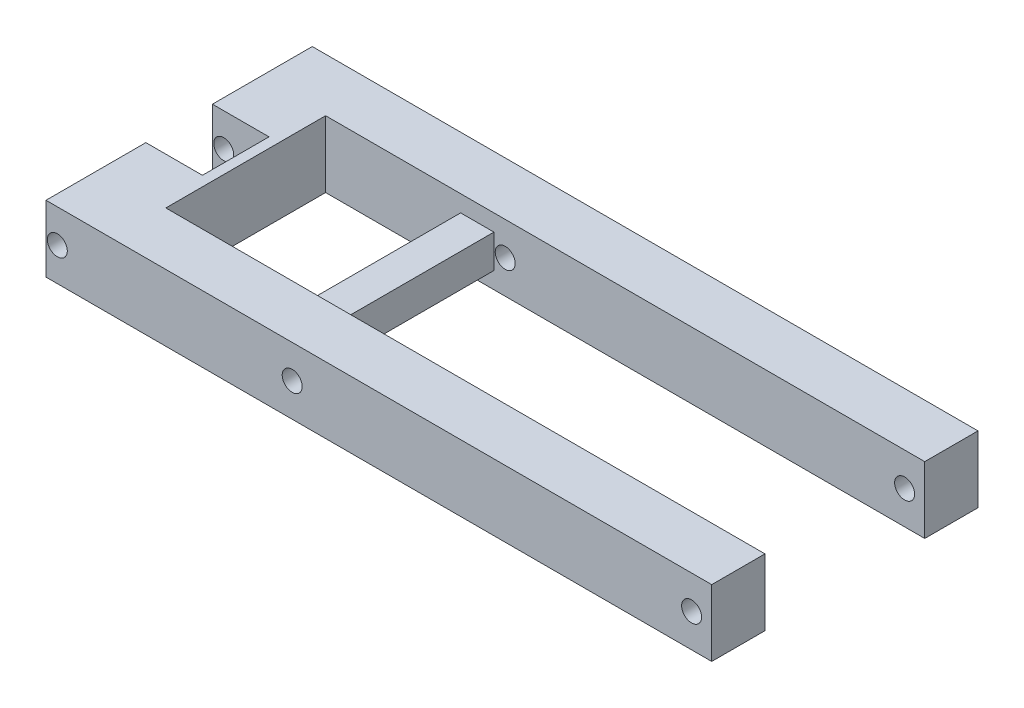
ISO-10303-21;
HEADER;
FILE_DESCRIPTION(('STEP AP214'),'2;1');
FILE_NAME('part.step','',(''),(''),'','','');
FILE_SCHEMA(('AUTOMOTIVE_DESIGN { 1 0 10303 214 1 1 1 1 }'));
ENDSEC;
DATA;
#1=APPLICATION_CONTEXT('core data for automotive mechanical design processes');
#2=APPLICATION_PROTOCOL_DEFINITION('international standard','automotive_design',2000,#1);
#3=PRODUCT_CONTEXT('',#1,'mechanical');
#4=PRODUCT('Part','Part','',(#3));
#5=PRODUCT_RELATED_PRODUCT_CATEGORY('part','',(#4));
#6=PRODUCT_DEFINITION_FORMATION('','',#4);
#7=PRODUCT_DEFINITION_CONTEXT('part definition',#1,'design');
#8=PRODUCT_DEFINITION('design','',#6,#7);
#9=PRODUCT_DEFINITION_SHAPE('','',#8);
#10=(LENGTH_UNIT() NAMED_UNIT(*) SI_UNIT(.MILLI.,.METRE.));
#11=(NAMED_UNIT(*) PLANE_ANGLE_UNIT() SI_UNIT($,.RADIAN.));
#12=(NAMED_UNIT(*) SI_UNIT($,.STERADIAN.) SOLID_ANGLE_UNIT());
#13=UNCERTAINTY_MEASURE_WITH_UNIT(LENGTH_MEASURE(1.E-05),#10,'distance_accuracy_value','');
#14=(GEOMETRIC_REPRESENTATION_CONTEXT(3) GLOBAL_UNCERTAINTY_ASSIGNED_CONTEXT((#13)) GLOBAL_UNIT_ASSIGNED_CONTEXT((#10,
#11,#12)) REPRESENTATION_CONTEXT('',''));
#15=CARTESIAN_POINT('',(0.,0.,0.));
#16=DIRECTION('',(0.,0.,1.));
#17=DIRECTION('',(1.,0.,0.));
#18=AXIS2_PLACEMENT_3D('',#15,#16,#17);
#19=CARTESIAN_POINT('',(-332.846822005894,100.,200.));
#20=DIRECTION('',(1.,0.,0.));
#21=DIRECTION('',(0.,0.,-1.));
#22=AXIS2_PLACEMENT_3D('',#19,#20,#21);
#23=PLANE('',#22);
#24=DIRECTION('',(0.,-1.,0.));
#25=VECTOR('',#24,1.);
#26=CARTESIAN_POINT('',(-332.846822005894,100.,50.));
#27=LINE('',#26,#25);
#28=CARTESIAN_POINT('',(-332.846822005894,100.,50.));
#29=VERTEX_POINT('',#28);
#30=CARTESIAN_POINT('',(-332.846822005894,0.,50.));
#31=VERTEX_POINT('',#30);
#32=EDGE_CURVE('E227',#29,#31,#27,.T.);
#33=ORIENTED_EDGE('',*,*,#32,.T.);
#34=DIRECTION('',(0.,0.,1.));
#35=VECTOR('',#34,1.);
#36=CARTESIAN_POINT('',(-332.846822005894,0.,200.));
#37=LINE('',#36,#35);
#38=CARTESIAN_POINT('',(-332.846822005894,0.,200.));
#39=VERTEX_POINT('',#38);
#40=EDGE_CURVE('E322',#31,#39,#37,.T.);
#41=ORIENTED_EDGE('',*,*,#40,.T.);
#42=DIRECTION('',(0.,-1.,0.));
#43=VECTOR('',#42,1.);
#44=CARTESIAN_POINT('',(-332.846822005894,100.,200.));
#45=LINE('',#44,#43);
#46=CARTESIAN_POINT('',(-332.846822005894,100.,200.));
#47=VERTEX_POINT('',#46);
#48=EDGE_CURVE('E339',#47,#39,#45,.T.);
#49=ORIENTED_EDGE('',*,*,#48,.F.);
#50=DIRECTION('',(0.,0.,1.));
#51=VECTOR('',#50,1.);
#52=CARTESIAN_POINT('',(-332.846822005894,100.,200.));
#53=LINE('',#52,#51);
#54=EDGE_CURVE('E295',#29,#47,#53,.T.);
#55=ORIENTED_EDGE('',*,*,#54,.F.);
#56=EDGE_LOOP('',(#33,#41,#49,#55));
#57=FACE_BOUND('',#56,.T.);
#58=ADVANCED_FACE('F39',(#57),#23,.F.);
#59=CARTESIAN_POINT('',(-315.846822005894,50.,-200.));
#60=DIRECTION('',(0.,0.,1.));
#61=DIRECTION('',(1.,0.,0.));
#62=AXIS2_PLACEMENT_3D('',#59,#60,#61);
#63=CYLINDRICAL_SURFACE('',#62,15.);
#64=CARTESIAN_POINT('',(-315.846822005894,50.,200.));
#65=DIRECTION('',(0.,0.,1.));
#66=DIRECTION('',(1.,0.,0.));
#67=AXIS2_PLACEMENT_3D('',#64,#65,#66);
#68=CIRCLE('',#67,15.);
#69=CARTESIAN_POINT('',(-300.846822005894,50.,200.));
#70=VERTEX_POINT('',#69);
#71=EDGE_CURVE('E237',#70,#70,#68,.T.);
#72=ORIENTED_EDGE('',*,*,#71,.T.);
#73=EDGE_LOOP('',(#72));
#74=FACE_BOUND('',#73,.T.);
#75=CARTESIAN_POINT('',(-315.846822005894,50.,50.));
#76=DIRECTION('',(0.,0.,-1.));
#77=DIRECTION('',(-1.,0.,0.));
#78=AXIS2_PLACEMENT_3D('',#75,#76,#77);
#79=CIRCLE('',#78,15.);
#80=CARTESIAN_POINT('',(-330.846822005894,50.,50.));
#81=VERTEX_POINT('',#80);
#82=EDGE_CURVE('E226',#81,#81,#79,.F.);
#83=ORIENTED_EDGE('',*,*,#82,.F.);
#84=EDGE_LOOP('',(#83));
#85=FACE_BOUND('',#84,.T.);
#86=ADVANCED_FACE('F388',(#74,#85),#63,.F.);
#87=CARTESIAN_POINT('',(667.153177994106,100.,120.));
#88=DIRECTION('',(0.,0.,1.));
#89=DIRECTION('',(1.,0.,0.));
#90=AXIS2_PLACEMENT_3D('',#87,#88,#89);
#91=PLANE('',#90);
#92=DIRECTION('',(-1.,0.,0.));
#93=VECTOR('',#92,1.);
#94=CARTESIAN_POINT('',(-30.,75.,120.));
#95=LINE('',#94,#93);
#96=CARTESIAN_POINT('',(20.,75.,120.));
#97=VERTEX_POINT('',#96);
#98=CARTESIAN_POINT('',(-30.,75.,120.));
#99=VERTEX_POINT('',#98);
#100=EDGE_CURVE('E168',#97,#99,#95,.T.);
#101=ORIENTED_EDGE('',*,*,#100,.T.);
#102=DIRECTION('',(0.,-1.,0.));
#103=VECTOR('',#102,1.);
#104=CARTESIAN_POINT('',(-30.,25.,120.));
#105=LINE('',#104,#103);
#106=CARTESIAN_POINT('',(-30.,25.,120.));
#107=VERTEX_POINT('',#106);
#108=EDGE_CURVE('E57',#99,#107,#105,.T.);
#109=ORIENTED_EDGE('',*,*,#108,.T.);
#110=DIRECTION('',(1.,0.,0.));
#111=VECTOR('',#110,1.);
#112=CARTESIAN_POINT('',(20.,25.,120.));
#113=LINE('',#112,#111);
#114=CARTESIAN_POINT('',(20.,25.,120.));
#115=VERTEX_POINT('',#114);
#116=EDGE_CURVE('E175',#107,#115,#113,.T.);
#117=ORIENTED_EDGE('',*,*,#116,.T.);
#118=DIRECTION('',(0.,1.,0.));
#119=VECTOR('',#118,1.);
#120=CARTESIAN_POINT('',(20.,75.,120.));
#121=LINE('',#120,#119);
#122=EDGE_CURVE('E158',#115,#97,#121,.T.);
#123=ORIENTED_EDGE('',*,*,#122,.T.);
#124=EDGE_LOOP('',(#101,#109,#117,#123));
#125=FACE_BOUND('',#124,.T.);
#126=CARTESIAN_POINT('',(36.953177994106,50.,120.));
#127=DIRECTION('',(0.,0.,1.));
#128=DIRECTION('',(1.,0.,0.));
#129=AXIS2_PLACEMENT_3D('',#126,#127,#128);
#130=CIRCLE('',#129,15.0000000000001);
#131=CARTESIAN_POINT('',(51.9531779941061,50.,120.));
#132=VERTEX_POINT('',#131);
#133=EDGE_CURVE('E273',#132,#132,#130,.T.);
#134=ORIENTED_EDGE('',*,*,#133,.T.);
#135=EDGE_LOOP('',(#134));
#136=FACE_BOUND('',#135,.T.);
#137=CARTESIAN_POINT('',(636.953177994106,50.,120.));
#138=DIRECTION('',(0.,0.,1.));
#139=DIRECTION('',(1.,0.,0.));
#140=AXIS2_PLACEMENT_3D('',#137,#138,#139);
#141=CIRCLE('',#140,15.);
#142=CARTESIAN_POINT('',(651.953177994106,50.,120.));
#143=VERTEX_POINT('',#142);
#144=EDGE_CURVE('E265',#143,#143,#141,.T.);
#145=ORIENTED_EDGE('',*,*,#144,.T.);
#146=EDGE_LOOP('',(#145));
#147=FACE_BOUND('',#146,.T.);
#148=DIRECTION('',(-1.,0.,0.));
#149=VECTOR('',#148,1.);
#150=CARTESIAN_POINT('',(667.153177994106,0.,120.));
#151=LINE('',#150,#149);
#152=CARTESIAN_POINT('',(667.153177994106,0.,120.));
#153=VERTEX_POINT('',#152);
#154=CARTESIAN_POINT('',(-232.846822005894,0.,120.));
#155=VERTEX_POINT('',#154);
#156=EDGE_CURVE('E277',#153,#155,#151,.T.);
#157=ORIENTED_EDGE('',*,*,#156,.T.);
#158=DIRECTION('',(0.,-1.,0.));
#159=VECTOR('',#158,1.);
#160=CARTESIAN_POINT('',(-232.846822005894,100.,120.));
#161=LINE('',#160,#159);
#162=CARTESIAN_POINT('',(-232.846822005894,100.,120.));
#163=VERTEX_POINT('',#162);
#164=EDGE_CURVE('E11',#163,#155,#161,.T.);
#165=ORIENTED_EDGE('',*,*,#164,.F.);
#166=DIRECTION('',(-1.,0.,0.));
#167=VECTOR('',#166,1.);
#168=CARTESIAN_POINT('',(667.153177994106,100.,120.));
#169=LINE('',#168,#167);
#170=CARTESIAN_POINT('',(667.153177994106,100.,120.));
#171=VERTEX_POINT('',#170);
#172=EDGE_CURVE('E278',#171,#163,#169,.T.);
#173=ORIENTED_EDGE('',*,*,#172,.F.);
#174=DIRECTION('',(0.,-1.,0.));
#175=VECTOR('',#174,1.);
#176=CARTESIAN_POINT('',(667.153177994106,100.,120.));
#177=LINE('',#176,#175);
#178=EDGE_CURVE('E306',#171,#153,#177,.T.);
#179=ORIENTED_EDGE('',*,*,#178,.T.);
#180=EDGE_LOOP('',(#157,#165,#173,#179));
#181=FACE_BOUND('',#180,.T.);
#182=ADVANCED_FACE('F41',(#125,#136,#147,#181),#91,.F.);
#183=CARTESIAN_POINT('',(-232.846822005894,100.,-120.));
#184=DIRECTION('',(-1.,0.,0.));
#185=DIRECTION('',(0.,0.,1.));
#186=AXIS2_PLACEMENT_3D('',#183,#184,#185);
#187=PLANE('',#186);
#188=DIRECTION('',(0.,0.,-1.));
#189=VECTOR('',#188,1.);
#190=CARTESIAN_POINT('',(-232.846822005894,0.,-120.));
#191=LINE('',#190,#189);
#192=CARTESIAN_POINT('',(-232.846822005894,0.,-120.));
#193=VERTEX_POINT('',#192);
#194=EDGE_CURVE('E310',#155,#193,#191,.T.);
#195=ORIENTED_EDGE('',*,*,#194,.T.);
#196=DIRECTION('',(0.,-1.,0.));
#197=VECTOR('',#196,1.);
#198=CARTESIAN_POINT('',(-232.846822005894,100.,-120.));
#199=LINE('',#198,#197);
#200=CARTESIAN_POINT('',(-232.846822005894,100.,-120.));
#201=VERTEX_POINT('',#200);
#202=EDGE_CURVE('E49',#201,#193,#199,.T.);
#203=ORIENTED_EDGE('',*,*,#202,.F.);
#204=DIRECTION('',(0.,0.,-1.));
#205=VECTOR('',#204,1.);
#206=CARTESIAN_POINT('',(-232.846822005894,100.,-120.));
#207=LINE('',#206,#205);
#208=EDGE_CURVE('E282',#163,#201,#207,.T.);
#209=ORIENTED_EDGE('',*,*,#208,.F.);
#210=ORIENTED_EDGE('',*,*,#164,.T.);
#211=EDGE_LOOP('',(#195,#203,#209,#210));
#212=FACE_BOUND('',#211,.T.);
#213=ADVANCED_FACE('F439',(#212),#187,.F.);
#214=CARTESIAN_POINT('',(667.153177994106,100.,-120.));
#215=DIRECTION('',(0.,0.,-1.));
#216=DIRECTION('',(-1.,0.,0.));
#217=AXIS2_PLACEMENT_3D('',#214,#215,#216);
#218=PLANE('',#217);
#219=DIRECTION('',(1.,0.,0.));
#220=VECTOR('',#219,1.);
#221=CARTESIAN_POINT('',(20.,25.,-120.));
#222=LINE('',#221,#220);
#223=CARTESIAN_POINT('',(-30.,25.,-120.));
#224=VERTEX_POINT('',#223);
#225=CARTESIAN_POINT('',(20.,25.,-120.));
#226=VERTEX_POINT('',#225);
#227=EDGE_CURVE('E185',#224,#226,#222,.T.);
#228=ORIENTED_EDGE('',*,*,#227,.F.);
#229=DIRECTION('',(0.,-1.,0.));
#230=VECTOR('',#229,1.);
#231=CARTESIAN_POINT('',(-30.,25.,-120.));
#232=LINE('',#231,#230);
#233=CARTESIAN_POINT('',(-30.,75.,-120.));
#234=VERTEX_POINT('',#233);
#235=EDGE_CURVE('E182',#234,#224,#232,.T.);
#236=ORIENTED_EDGE('',*,*,#235,.F.);
#237=DIRECTION('',(-1.,0.,0.));
#238=VECTOR('',#237,1.);
#239=CARTESIAN_POINT('',(-30.,75.,-120.));
#240=LINE('',#239,#238);
#241=CARTESIAN_POINT('',(20.,75.,-120.));
#242=VERTEX_POINT('',#241);
#243=EDGE_CURVE('E190',#242,#234,#240,.T.);
#244=ORIENTED_EDGE('',*,*,#243,.F.);
#245=DIRECTION('',(0.,1.,0.));
#246=VECTOR('',#245,1.);
#247=CARTESIAN_POINT('',(20.,75.,-120.));
#248=LINE('',#247,#246);
#249=EDGE_CURVE('E161',#226,#242,#248,.T.);
#250=ORIENTED_EDGE('',*,*,#249,.F.);
#251=EDGE_LOOP('',(#228,#236,#244,#250));
#252=FACE_BOUND('',#251,.T.);
#253=CARTESIAN_POINT('',(36.953177994106,50.,-120.));
#254=DIRECTION('',(0.,0.,-1.));
#255=DIRECTION('',(-1.,0.,0.));
#256=AXIS2_PLACEMENT_3D('',#253,#254,#255);
#257=CIRCLE('',#256,15.0000000000001);
#258=CARTESIAN_POINT('',(21.953177994106,50.,-120.));
#259=VERTEX_POINT('',#258);
#260=EDGE_CURVE('E269',#259,#259,#257,.T.);
#261=ORIENTED_EDGE('',*,*,#260,.T.);
#262=EDGE_LOOP('',(#261));
#263=FACE_BOUND('',#262,.T.);
#264=CARTESIAN_POINT('',(636.953177994106,50.,-120.));
#265=DIRECTION('',(0.,0.,-1.));
#266=DIRECTION('',(-1.,0.,0.));
#267=AXIS2_PLACEMENT_3D('',#264,#265,#266);
#268=CIRCLE('',#267,15.);
#269=CARTESIAN_POINT('',(621.953177994106,50.,-120.));
#270=VERTEX_POINT('',#269);
#271=EDGE_CURVE('E246',#270,#270,#268,.T.);
#272=ORIENTED_EDGE('',*,*,#271,.T.);
#273=EDGE_LOOP('',(#272));
#274=FACE_BOUND('',#273,.T.);
#275=DIRECTION('',(1.,0.,0.));
#276=VECTOR('',#275,1.);
#277=CARTESIAN_POINT('',(667.153177994106,0.,-120.));
#278=LINE('',#277,#276);
#279=CARTESIAN_POINT('',(667.153177994106,0.,-120.));
#280=VERTEX_POINT('',#279);
#281=EDGE_CURVE('E313',#193,#280,#278,.T.);
#282=ORIENTED_EDGE('',*,*,#281,.T.);
#283=DIRECTION('',(0.,-1.,0.));
#284=VECTOR('',#283,1.);
#285=CARTESIAN_POINT('',(667.153177994106,100.,-120.));
#286=LINE('',#285,#284);
#287=CARTESIAN_POINT('',(667.153177994106,100.,-120.));
#288=VERTEX_POINT('',#287);
#289=EDGE_CURVE('E351',#288,#280,#286,.T.);
#290=ORIENTED_EDGE('',*,*,#289,.F.);
#291=DIRECTION('',(1.,0.,0.));
#292=VECTOR('',#291,1.);
#293=CARTESIAN_POINT('',(667.153177994106,100.,-120.));
#294=LINE('',#293,#292);
#295=EDGE_CURVE('E286',#201,#288,#294,.T.);
#296=ORIENTED_EDGE('',*,*,#295,.F.);
#297=ORIENTED_EDGE('',*,*,#202,.T.);
#298=EDGE_LOOP('',(#282,#290,#296,#297));
#299=FACE_BOUND('',#298,.T.);
#300=ADVANCED_FACE('F435',(#252,#263,#274,#299),#218,.F.);
#301=CARTESIAN_POINT('',(667.153177994106,100.,-200.));
#302=DIRECTION('',(-1.,0.,0.));
#303=DIRECTION('',(0.,0.,1.));
#304=AXIS2_PLACEMENT_3D('',#301,#302,#303);
#305=PLANE('',#304);
#306=DIRECTION('',(0.,0.,-1.));
#307=VECTOR('',#306,1.);
#308=CARTESIAN_POINT('',(667.153177994106,0.,-200.));
#309=LINE('',#308,#307);
#310=CARTESIAN_POINT('',(667.153177994106,0.,-200.));
#311=VERTEX_POINT('',#310);
#312=EDGE_CURVE('E316',#280,#311,#309,.T.);
#313=ORIENTED_EDGE('',*,*,#312,.T.);
#314=DIRECTION('',(0.,-1.,0.));
#315=VECTOR('',#314,1.);
#316=CARTESIAN_POINT('',(667.153177994106,100.,-200.));
#317=LINE('',#316,#315);
#318=CARTESIAN_POINT('',(667.153177994106,100.,-200.));
#319=VERTEX_POINT('',#318);
#320=EDGE_CURVE('E347',#319,#311,#317,.T.);
#321=ORIENTED_EDGE('',*,*,#320,.F.);
#322=DIRECTION('',(0.,0.,-1.));
#323=VECTOR('',#322,1.);
#324=CARTESIAN_POINT('',(667.153177994106,100.,-200.));
#325=LINE('',#324,#323);
#326=EDGE_CURVE('E289',#288,#319,#325,.T.);
#327=ORIENTED_EDGE('',*,*,#326,.F.);
#328=ORIENTED_EDGE('',*,*,#289,.T.);
#329=EDGE_LOOP('',(#313,#321,#327,#328));
#330=FACE_BOUND('',#329,.T.);
#331=ADVANCED_FACE('F408',(#330),#305,.F.);
#332=CARTESIAN_POINT('',(-332.846822005894,100.,-200.));
#333=DIRECTION('',(0.,0.,1.));
#334=DIRECTION('',(1.,0.,0.));
#335=AXIS2_PLACEMENT_3D('',#332,#333,#334);
#336=PLANE('',#335);
#337=CARTESIAN_POINT('',(-315.846822005894,50.,-200.));
#338=DIRECTION('',(0.,0.,1.));
#339=DIRECTION('',(1.,0.,0.));
#340=AXIS2_PLACEMENT_3D('',#337,#338,#339);
#341=CIRCLE('',#340,15.);
#342=CARTESIAN_POINT('',(-300.846822005894,50.,-200.));
#343=VERTEX_POINT('',#342);
#344=EDGE_CURVE('E241',#343,#343,#341,.T.);
#345=ORIENTED_EDGE('',*,*,#344,.T.);
#346=EDGE_LOOP('',(#345));
#347=FACE_BOUND('',#346,.T.);
#348=CARTESIAN_POINT('',(36.953177994106,50.,-200.));
#349=DIRECTION('',(0.,0.,1.));
#350=DIRECTION('',(1.,0.,0.));
#351=AXIS2_PLACEMENT_3D('',#348,#349,#350);
#352=CIRCLE('',#351,15.0000000000001);
#353=CARTESIAN_POINT('',(51.9531779941061,50.,-200.));
#354=VERTEX_POINT('',#353);
#355=EDGE_CURVE('E242',#354,#354,#352,.T.);
#356=ORIENTED_EDGE('',*,*,#355,.T.);
#357=EDGE_LOOP('',(#356));
#358=FACE_BOUND('',#357,.T.);
#359=CARTESIAN_POINT('',(636.953177994106,50.,-200.));
#360=DIRECTION('',(0.,0.,1.));
#361=DIRECTION('',(1.,0.,0.));
#362=AXIS2_PLACEMENT_3D('',#359,#360,#361);
#363=CIRCLE('',#362,15.);
#364=CARTESIAN_POINT('',(651.953177994106,50.,-200.));
#365=VERTEX_POINT('',#364);
#366=EDGE_CURVE('E251',#365,#365,#363,.T.);
#367=ORIENTED_EDGE('',*,*,#366,.T.);
#368=EDGE_LOOP('',(#367));
#369=FACE_BOUND('',#368,.T.);
#370=DIRECTION('',(-1.,0.,0.));
#371=VECTOR('',#370,1.);
#372=CARTESIAN_POINT('',(-332.846822005894,0.,-200.));
#373=LINE('',#372,#371);
#374=CARTESIAN_POINT('',(-332.846822005894,0.,-200.));
#375=VERTEX_POINT('',#374);
#376=EDGE_CURVE('E319',#311,#375,#373,.T.);
#377=ORIENTED_EDGE('',*,*,#376,.T.);
#378=DIRECTION('',(0.,-1.,0.));
#379=VECTOR('',#378,1.);
#380=CARTESIAN_POINT('',(-332.846822005894,100.,-200.));
#381=LINE('',#380,#379);
#382=CARTESIAN_POINT('',(-332.846822005894,100.,-200.));
#383=VERTEX_POINT('',#382);
#384=EDGE_CURVE('E343',#383,#375,#381,.T.);
#385=ORIENTED_EDGE('',*,*,#384,.F.);
#386=DIRECTION('',(-1.,0.,0.));
#387=VECTOR('',#386,1.);
#388=CARTESIAN_POINT('',(-332.846822005894,100.,-200.));
#389=LINE('',#388,#387);
#390=EDGE_CURVE('E292',#319,#383,#389,.T.);
#391=ORIENTED_EDGE('',*,*,#390,.F.);
#392=ORIENTED_EDGE('',*,*,#320,.T.);
#393=EDGE_LOOP('',(#377,#385,#391,#392));
#394=FACE_BOUND('',#393,.T.);
#395=ADVANCED_FACE('F400',(#347,#358,#369,#394),#336,.F.);
#396=CARTESIAN_POINT('',(-332.846822005894,0.,-50.));
#397=VERTEX_POINT('',#396);
#398=EDGE_CURVE('E323',#375,#397,#37,.T.);
#399=ORIENTED_EDGE('',*,*,#398,.T.);
#400=DIRECTION('',(0.,-1.,0.));
#401=VECTOR('',#400,1.);
#402=CARTESIAN_POINT('',(-332.846822005894,100.,-50.));
#403=LINE('',#402,#401);
#404=CARTESIAN_POINT('',(-332.846822005894,100.,-50.));
#405=VERTEX_POINT('',#404);
#406=EDGE_CURVE('E223',#405,#397,#403,.T.);
#407=ORIENTED_EDGE('',*,*,#406,.F.);
#408=EDGE_CURVE('E296',#383,#405,#53,.T.);
#409=ORIENTED_EDGE('',*,*,#408,.F.);
#410=ORIENTED_EDGE('',*,*,#384,.T.);
#411=EDGE_LOOP('',(#399,#407,#409,#410));
#412=FACE_BOUND('',#411,.T.);
#413=ADVANCED_FACE('F391',(#412),#23,.F.);
#414=CARTESIAN_POINT('',(-332.846822005894,100.,200.));
#415=DIRECTION('',(0.,0.,-1.));
#416=DIRECTION('',(-1.,0.,0.));
#417=AXIS2_PLACEMENT_3D('',#414,#415,#416);
#418=PLANE('',#417);
#419=ORIENTED_EDGE('',*,*,#71,.F.);
#420=EDGE_LOOP('',(#419));
#421=FACE_BOUND('',#420,.T.);
#422=CARTESIAN_POINT('',(36.953177994106,50.,200.));
#423=DIRECTION('',(0.,0.,1.));
#424=DIRECTION('',(1.,0.,0.));
#425=AXIS2_PLACEMENT_3D('',#422,#423,#424);
#426=CIRCLE('',#425,15.0000000000001);
#427=CARTESIAN_POINT('',(51.9531779941061,50.,200.));
#428=VERTEX_POINT('',#427);
#429=EDGE_CURVE('E247',#428,#428,#426,.T.);
#430=ORIENTED_EDGE('',*,*,#429,.F.);
#431=EDGE_LOOP('',(#430));
#432=FACE_BOUND('',#431,.T.);
#433=CARTESIAN_POINT('',(636.953177994106,50.,200.));
#434=DIRECTION('',(0.,0.,1.));
#435=DIRECTION('',(1.,0.,0.));
#436=AXIS2_PLACEMENT_3D('',#433,#434,#435);
#437=CIRCLE('',#436,15.);
#438=CARTESIAN_POINT('',(651.953177994106,50.,200.));
#439=VERTEX_POINT('',#438);
#440=EDGE_CURVE('E255',#439,#439,#437,.T.);
#441=ORIENTED_EDGE('',*,*,#440,.F.);
#442=EDGE_LOOP('',(#441));
#443=FACE_BOUND('',#442,.T.);
#444=DIRECTION('',(1.,0.,0.));
#445=VECTOR('',#444,1.);
#446=CARTESIAN_POINT('',(-332.846822005894,0.,200.));
#447=LINE('',#446,#445);
#448=CARTESIAN_POINT('',(667.153177994106,0.,200.));
#449=VERTEX_POINT('',#448);
#450=EDGE_CURVE('E327',#39,#449,#447,.T.);
#451=ORIENTED_EDGE('',*,*,#450,.T.);
#452=DIRECTION('',(0.,-1.,0.));
#453=VECTOR('',#452,1.);
#454=CARTESIAN_POINT('',(667.153177994106,100.,200.));
#455=LINE('',#454,#453);
#456=CARTESIAN_POINT('',(667.153177994106,100.,200.));
#457=VERTEX_POINT('',#456);
#458=EDGE_CURVE('E335',#457,#449,#455,.T.);
#459=ORIENTED_EDGE('',*,*,#458,.F.);
#460=DIRECTION('',(1.,0.,0.));
#461=VECTOR('',#460,1.);
#462=CARTESIAN_POINT('',(-332.846822005894,100.,200.));
#463=LINE('',#462,#461);
#464=EDGE_CURVE('E300',#47,#457,#463,.T.);
#465=ORIENTED_EDGE('',*,*,#464,.F.);
#466=ORIENTED_EDGE('',*,*,#48,.T.);
#467=EDGE_LOOP('',(#451,#459,#465,#466));
#468=FACE_BOUND('',#467,.T.);
#469=ADVANCED_FACE('F399',(#421,#432,#443,#468),#418,.F.);
#470=CARTESIAN_POINT('',(667.153177994106,100.,200.));
#471=DIRECTION('',(-1.,0.,0.));
#472=DIRECTION('',(0.,0.,1.));
#473=AXIS2_PLACEMENT_3D('',#470,#471,#472);
#474=PLANE('',#473);
#475=DIRECTION('',(0.,0.,-1.));
#476=VECTOR('',#475,1.);
#477=CARTESIAN_POINT('',(667.153177994106,0.,200.));
#478=LINE('',#477,#476);
#479=EDGE_CURVE('E283',#449,#153,#478,.T.);
#480=ORIENTED_EDGE('',*,*,#479,.T.);
#481=ORIENTED_EDGE('',*,*,#178,.F.);
#482=DIRECTION('',(0.,0.,-1.));
#483=VECTOR('',#482,1.);
#484=CARTESIAN_POINT('',(667.153177994106,100.,200.));
#485=LINE('',#484,#483);
#486=EDGE_CURVE('E303',#457,#171,#485,.T.);
#487=ORIENTED_EDGE('',*,*,#486,.F.);
#488=ORIENTED_EDGE('',*,*,#458,.T.);
#489=EDGE_LOOP('',(#480,#481,#487,#488));
#490=FACE_BOUND('',#489,.T.);
#491=ADVANCED_FACE('F406',(#490),#474,.F.);
#492=CARTESIAN_POINT('',(0.,100.,0.));
#493=DIRECTION('',(0.,1.,0.));
#494=DIRECTION('',(0.,0.,1.));
#495=AXIS2_PLACEMENT_3D('',#492,#493,#494);
#496=PLANE('',#495);
#497=DIRECTION('',(1.,0.,0.));
#498=VECTOR('',#497,1.);
#499=CARTESIAN_POINT('',(-332.846822005894,100.,-50.));
#500=LINE('',#499,#498);
#501=CARTESIAN_POINT('',(-247.846822005894,100.,-50.));
#502=VERTEX_POINT('',#501);
#503=EDGE_CURVE('E201',#405,#502,#500,.T.);
#504=ORIENTED_EDGE('',*,*,#503,.T.);
#505=DIRECTION('',(0.,0.,1.));
#506=VECTOR('',#505,1.);
#507=CARTESIAN_POINT('',(-247.846822005894,100.,-50.));
#508=LINE('',#507,#506);
#509=CARTESIAN_POINT('',(-247.846822005894,100.,50.));
#510=VERTEX_POINT('',#509);
#511=EDGE_CURVE('E205',#502,#510,#508,.T.);
#512=ORIENTED_EDGE('',*,*,#511,.T.);
#513=DIRECTION('',(1.,0.,0.));
#514=VECTOR('',#513,1.);
#515=CARTESIAN_POINT('',(-332.846822005894,100.,50.));
#516=LINE('',#515,#514);
#517=EDGE_CURVE('E210',#29,#510,#516,.T.);
#518=ORIENTED_EDGE('',*,*,#517,.F.);
#519=ORIENTED_EDGE('',*,*,#54,.T.);
#520=ORIENTED_EDGE('',*,*,#464,.T.);
#521=ORIENTED_EDGE('',*,*,#486,.T.);
#522=ORIENTED_EDGE('',*,*,#172,.T.);
#523=ORIENTED_EDGE('',*,*,#208,.T.);
#524=ORIENTED_EDGE('',*,*,#295,.T.);
#525=ORIENTED_EDGE('',*,*,#326,.T.);
#526=ORIENTED_EDGE('',*,*,#390,.T.);
#527=ORIENTED_EDGE('',*,*,#408,.T.);
#528=EDGE_LOOP('',(#504,#512,#518,#519,#520,#521,#522,#523,#524,#525,#526,#527));
#529=FACE_BOUND('',#528,.T.);
#530=ADVANCED_FACE('F425',(#529),#496,.T.);
#531=CARTESIAN_POINT('',(0.,0.,0.));
#532=DIRECTION('',(0.,1.,0.));
#533=DIRECTION('',(0.,0.,1.));
#534=AXIS2_PLACEMENT_3D('',#531,#532,#533);
#535=PLANE('',#534);
#536=DIRECTION('',(0.,0.,1.));
#537=VECTOR('',#536,1.);
#538=CARTESIAN_POINT('',(-247.846822005894,0.,-50.));
#539=LINE('',#538,#537);
#540=CARTESIAN_POINT('',(-247.846822005894,0.,-50.));
#541=VERTEX_POINT('',#540);
#542=CARTESIAN_POINT('',(-247.846822005894,0.,50.));
#543=VERTEX_POINT('',#542);
#544=EDGE_CURVE('E216',#541,#543,#539,.T.);
#545=ORIENTED_EDGE('',*,*,#544,.F.);
#546=DIRECTION('',(1.,0.,0.));
#547=VECTOR('',#546,1.);
#548=CARTESIAN_POINT('',(-332.846822005894,0.,-50.));
#549=LINE('',#548,#547);
#550=EDGE_CURVE('E200',#397,#541,#549,.T.);
#551=ORIENTED_EDGE('',*,*,#550,.F.);
#552=ORIENTED_EDGE('',*,*,#398,.F.);
#553=ORIENTED_EDGE('',*,*,#376,.F.);
#554=ORIENTED_EDGE('',*,*,#312,.F.);
#555=ORIENTED_EDGE('',*,*,#281,.F.);
#556=ORIENTED_EDGE('',*,*,#194,.F.);
#557=ORIENTED_EDGE('',*,*,#156,.F.);
#558=ORIENTED_EDGE('',*,*,#479,.F.);
#559=ORIENTED_EDGE('',*,*,#450,.F.);
#560=ORIENTED_EDGE('',*,*,#40,.F.);
#561=DIRECTION('',(1.,0.,0.));
#562=VECTOR('',#561,1.);
#563=CARTESIAN_POINT('',(-332.846822005894,0.,50.));
#564=LINE('',#563,#562);
#565=EDGE_CURVE('E206',#31,#543,#564,.T.);
#566=ORIENTED_EDGE('',*,*,#565,.T.);
#567=EDGE_LOOP('',(#545,#551,#552,#553,#554,#555,#556,#557,#558,#559,#560,#566));
#568=FACE_BOUND('',#567,.T.);
#569=ADVANCED_FACE('F418',(#568),#535,.F.);
#570=CARTESIAN_POINT('',(636.953177994106,50.,-200.));
#571=DIRECTION('',(0.,0.,1.));
#572=DIRECTION('',(1.,0.,0.));
#573=AXIS2_PLACEMENT_3D('',#570,#571,#572);
#574=CYLINDRICAL_SURFACE('',#573,15.);
#575=ORIENTED_EDGE('',*,*,#440,.T.);
#576=EDGE_LOOP('',(#575));
#577=FACE_BOUND('',#576,.T.);
#578=ORIENTED_EDGE('',*,*,#144,.F.);
#579=EDGE_LOOP('',(#578));
#580=FACE_BOUND('',#579,.T.);
#581=ADVANCED_FACE('F464',(#577,#580),#574,.F.);
#582=CARTESIAN_POINT('',(36.953177994106,50.,-200.));
#583=DIRECTION('',(0.,0.,1.));
#584=DIRECTION('',(1.,0.,0.));
#585=AXIS2_PLACEMENT_3D('',#582,#583,#584);
#586=CYLINDRICAL_SURFACE('',#585,15.0000000000001);
#587=ORIENTED_EDGE('',*,*,#429,.T.);
#588=EDGE_LOOP('',(#587));
#589=FACE_BOUND('',#588,.T.);
#590=ORIENTED_EDGE('',*,*,#133,.F.);
#591=EDGE_LOOP('',(#590));
#592=FACE_BOUND('',#591,.T.);
#593=ADVANCED_FACE('F384',(#589,#592),#586,.F.);
#594=CARTESIAN_POINT('',(-315.846822005894,50.,-50.));
#595=DIRECTION('',(0.,0.,-1.));
#596=DIRECTION('',(-1.,0.,0.));
#597=AXIS2_PLACEMENT_3D('',#594,#595,#596);
#598=CIRCLE('',#597,15.);
#599=CARTESIAN_POINT('',(-330.846822005894,50.,-50.));
#600=VERTEX_POINT('',#599);
#601=EDGE_CURVE('E43',#600,#600,#598,.F.);
#602=ORIENTED_EDGE('',*,*,#601,.T.);
#603=EDGE_LOOP('',(#602));
#604=FACE_BOUND('',#603,.T.);
#605=ORIENTED_EDGE('',*,*,#344,.F.);
#606=EDGE_LOOP('',(#605));
#607=FACE_BOUND('',#606,.T.);
#608=ADVANCED_FACE('F365',(#604,#607),#63,.F.);
#609=ORIENTED_EDGE('',*,*,#366,.F.);
#610=EDGE_LOOP('',(#609));
#611=FACE_BOUND('',#610,.T.);
#612=ORIENTED_EDGE('',*,*,#271,.F.);
#613=EDGE_LOOP('',(#612));
#614=FACE_BOUND('',#613,.T.);
#615=ADVANCED_FACE('F381',(#611,#614),#574,.F.);
#616=ORIENTED_EDGE('',*,*,#355,.F.);
#617=EDGE_LOOP('',(#616));
#618=FACE_BOUND('',#617,.T.);
#619=ORIENTED_EDGE('',*,*,#260,.F.);
#620=EDGE_LOOP('',(#619));
#621=FACE_BOUND('',#620,.T.);
#622=ADVANCED_FACE('F371',(#618,#621),#586,.F.);
#623=CARTESIAN_POINT('',(-332.846822005894,100.,-50.));
#624=DIRECTION('',(0.,0.,-1.));
#625=DIRECTION('',(-1.,0.,0.));
#626=AXIS2_PLACEMENT_3D('',#623,#624,#625);
#627=PLANE('',#626);
#628=ORIENTED_EDGE('',*,*,#550,.T.);
#629=DIRECTION('',(0.,-1.,0.));
#630=VECTOR('',#629,1.);
#631=CARTESIAN_POINT('',(-247.846822005894,100.,-50.));
#632=LINE('',#631,#630);
#633=EDGE_CURVE('E213',#502,#541,#632,.T.);
#634=ORIENTED_EDGE('',*,*,#633,.F.);
#635=ORIENTED_EDGE('',*,*,#503,.F.);
#636=ORIENTED_EDGE('',*,*,#406,.T.);
#637=EDGE_LOOP('',(#628,#634,#635,#636));
#638=FACE_BOUND('',#637,.T.);
#639=ORIENTED_EDGE('',*,*,#601,.F.);
#640=EDGE_LOOP('',(#639));
#641=FACE_BOUND('',#640,.T.);
#642=ADVANCED_FACE('F368',(#638,#641),#627,.F.);
#643=CARTESIAN_POINT('',(-332.846822005894,100.,50.));
#644=DIRECTION('',(0.,0.,-1.));
#645=DIRECTION('',(-1.,0.,0.));
#646=AXIS2_PLACEMENT_3D('',#643,#644,#645);
#647=PLANE('',#646);
#648=ORIENTED_EDGE('',*,*,#565,.F.);
#649=ORIENTED_EDGE('',*,*,#32,.F.);
#650=ORIENTED_EDGE('',*,*,#517,.T.);
#651=DIRECTION('',(0.,-1.,0.));
#652=VECTOR('',#651,1.);
#653=CARTESIAN_POINT('',(-247.846822005894,100.,50.));
#654=LINE('',#653,#652);
#655=EDGE_CURVE('E231',#510,#543,#654,.T.);
#656=ORIENTED_EDGE('',*,*,#655,.T.);
#657=EDGE_LOOP('',(#648,#649,#650,#656));
#658=FACE_BOUND('',#657,.T.);
#659=ORIENTED_EDGE('',*,*,#82,.T.);
#660=EDGE_LOOP('',(#659));
#661=FACE_BOUND('',#660,.T.);
#662=ADVANCED_FACE('F370',(#658,#661),#647,.T.);
#663=CARTESIAN_POINT('',(-247.846822005894,100.,-50.));
#664=DIRECTION('',(1.,0.,0.));
#665=DIRECTION('',(0.,0.,-1.));
#666=AXIS2_PLACEMENT_3D('',#663,#664,#665);
#667=PLANE('',#666);
#668=ORIENTED_EDGE('',*,*,#544,.T.);
#669=ORIENTED_EDGE('',*,*,#655,.F.);
#670=ORIENTED_EDGE('',*,*,#511,.F.);
#671=ORIENTED_EDGE('',*,*,#633,.T.);
#672=EDGE_LOOP('',(#668,#669,#670,#671));
#673=FACE_BOUND('',#672,.T.);
#674=ADVANCED_FACE('F378',(#673),#667,.F.);
#675=CARTESIAN_POINT('',(-30.,25.,-200.002));
#676=DIRECTION('',(-1.,0.,0.));
#677=DIRECTION('',(0.,0.,1.));
#678=AXIS2_PLACEMENT_3D('',#675,#676,#677);
#679=PLANE('',#678);
#680=DIRECTION('',(0.,0.,1.));
#681=VECTOR('',#680,1.);
#682=CARTESIAN_POINT('',(-30.,75.,-200.002));
#683=LINE('',#682,#681);
#684=EDGE_CURVE('E164',#234,#99,#683,.T.);
#685=ORIENTED_EDGE('',*,*,#684,.F.);
#686=ORIENTED_EDGE('',*,*,#235,.T.);
#687=DIRECTION('',(0.,0.,1.));
#688=VECTOR('',#687,1.);
#689=CARTESIAN_POINT('',(-30.,25.,-200.002));
#690=LINE('',#689,#688);
#691=EDGE_CURVE('E193',#224,#107,#690,.T.);
#692=ORIENTED_EDGE('',*,*,#691,.T.);
#693=ORIENTED_EDGE('',*,*,#108,.F.);
#694=EDGE_LOOP('',(#685,#686,#692,#693));
#695=FACE_BOUND('',#694,.T.);
#696=ADVANCED_FACE('F497',(#695),#679,.T.);
#697=CARTESIAN_POINT('',(20.,25.,-200.002));
#698=DIRECTION('',(0.,-1.,0.));
#699=DIRECTION('',(1.,0.,0.));
#700=AXIS2_PLACEMENT_3D('',#697,#698,#699);
#701=PLANE('',#700);
#702=ORIENTED_EDGE('',*,*,#691,.F.);
#703=ORIENTED_EDGE('',*,*,#227,.T.);
#704=DIRECTION('',(0.,0.,1.));
#705=VECTOR('',#704,1.);
#706=CARTESIAN_POINT('',(20.,25.,-200.002));
#707=LINE('',#706,#705);
#708=EDGE_CURVE('E165',#226,#115,#707,.T.);
#709=ORIENTED_EDGE('',*,*,#708,.T.);
#710=ORIENTED_EDGE('',*,*,#116,.F.);
#711=EDGE_LOOP('',(#702,#703,#709,#710));
#712=FACE_BOUND('',#711,.T.);
#713=ADVANCED_FACE('F496',(#712),#701,.T.);
#714=CARTESIAN_POINT('',(20.,75.,-200.002));
#715=DIRECTION('',(1.,0.,0.));
#716=DIRECTION('',(0.,1.,0.));
#717=AXIS2_PLACEMENT_3D('',#714,#715,#716);
#718=PLANE('',#717);
#719=ORIENTED_EDGE('',*,*,#708,.F.);
#720=ORIENTED_EDGE('',*,*,#249,.T.);
#721=DIRECTION('',(0.,0.,1.));
#722=VECTOR('',#721,1.);
#723=CARTESIAN_POINT('',(20.,75.,-200.002));
#724=LINE('',#723,#722);
#725=EDGE_CURVE('E65',#242,#97,#724,.T.);
#726=ORIENTED_EDGE('',*,*,#725,.T.);
#727=ORIENTED_EDGE('',*,*,#122,.F.);
#728=EDGE_LOOP('',(#719,#720,#726,#727));
#729=FACE_BOUND('',#728,.T.);
#730=ADVANCED_FACE('F156',(#729),#718,.T.);
#731=CARTESIAN_POINT('',(-30.,75.,-200.002));
#732=DIRECTION('',(0.,1.,0.));
#733=DIRECTION('',(0.,0.,1.));
#734=AXIS2_PLACEMENT_3D('',#731,#732,#733);
#735=PLANE('',#734);
#736=ORIENTED_EDGE('',*,*,#725,.F.);
#737=ORIENTED_EDGE('',*,*,#243,.T.);
#738=ORIENTED_EDGE('',*,*,#684,.T.);
#739=ORIENTED_EDGE('',*,*,#100,.F.);
#740=EDGE_LOOP('',(#736,#737,#738,#739));
#741=FACE_BOUND('',#740,.T.);
#742=ADVANCED_FACE('F169',(#741),#735,.T.);
#743=CLOSED_SHELL('',(#58,#86,#182,#213,#300,#331,#395,#413,#469,#491,#530,#569,#581,#593,#608,
#615,#622,#642,#662,#674,#696,#713,#730,#742));
#744=MANIFOLD_SOLID_BREP('B2',#743);
#745=ADVANCED_BREP_SHAPE_REPRESENTATION('',(#18,#744),#14);
#746=SHAPE_DEFINITION_REPRESENTATION(#9,#745);
ENDSEC;
END-ISO-10303-21;
